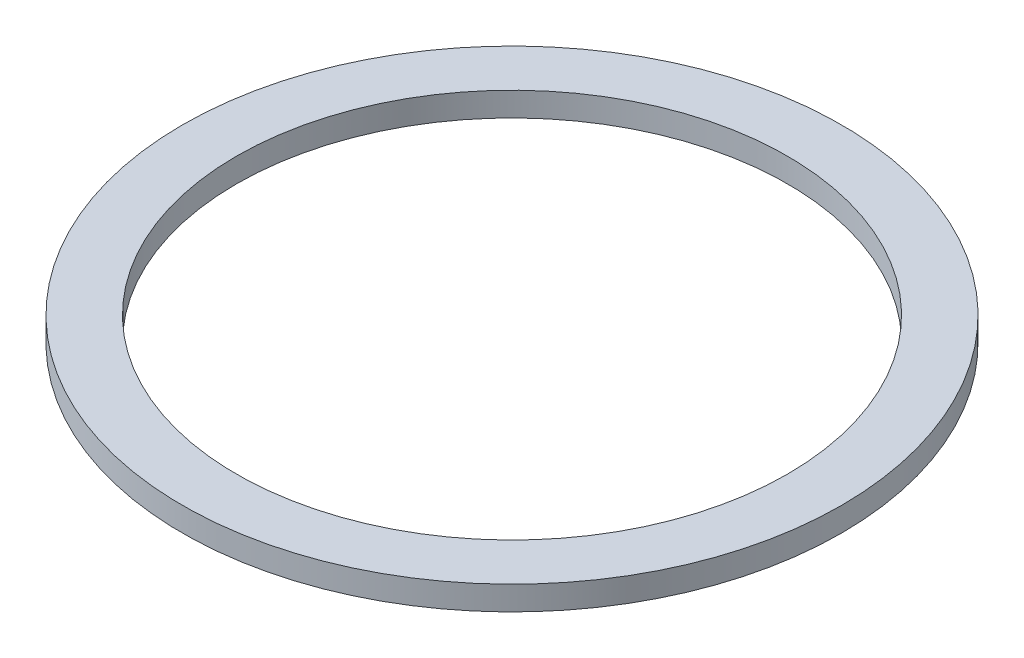
ISO-10303-21;
HEADER;
FILE_DESCRIPTION(('STEP AP214'),'2;1');
FILE_NAME('part.step','',(''),(''),'','','');
FILE_SCHEMA(('AUTOMOTIVE_DESIGN { 1 0 10303 214 1 1 1 1 }'));
ENDSEC;
DATA;
#1=APPLICATION_CONTEXT('core data for automotive mechanical design processes');
#2=APPLICATION_PROTOCOL_DEFINITION('international standard','automotive_design',2000,#1);
#3=PRODUCT_CONTEXT('',#1,'mechanical');
#4=PRODUCT('Part','Part','',(#3));
#5=PRODUCT_RELATED_PRODUCT_CATEGORY('part','',(#4));
#6=PRODUCT_DEFINITION_FORMATION('','',#4);
#7=PRODUCT_DEFINITION_CONTEXT('part definition',#1,'design');
#8=PRODUCT_DEFINITION('design','',#6,#7);
#9=PRODUCT_DEFINITION_SHAPE('','',#8);
#10=(LENGTH_UNIT() NAMED_UNIT(*) SI_UNIT(.MILLI.,.METRE.));
#11=(NAMED_UNIT(*) PLANE_ANGLE_UNIT() SI_UNIT($,.RADIAN.));
#12=(NAMED_UNIT(*) SI_UNIT($,.STERADIAN.) SOLID_ANGLE_UNIT());
#13=UNCERTAINTY_MEASURE_WITH_UNIT(LENGTH_MEASURE(1.E-05),#10,'distance_accuracy_value','');
#14=(GEOMETRIC_REPRESENTATION_CONTEXT(3) GLOBAL_UNCERTAINTY_ASSIGNED_CONTEXT((#13)) GLOBAL_UNIT_ASSIGNED_CONTEXT((#10,
#11,#12)) REPRESENTATION_CONTEXT('',''));
#15=CARTESIAN_POINT('',(0.,0.,0.));
#16=DIRECTION('',(0.,0.,1.));
#17=DIRECTION('',(1.,0.,0.));
#18=AXIS2_PLACEMENT_3D('',#15,#16,#17);
#19=CARTESIAN_POINT('',(145.526233776571,198.783659956239,0.));
#20=DIRECTION('',(0.,1.,0.));
#21=DIRECTION('',(-1.,0.,0.));
#22=AXIS2_PLACEMENT_3D('',#19,#20,#21);
#23=PLANE('',#22);
#24=CARTESIAN_POINT('',(-6.95186718038395E-13,198.783659956234,0.));
#25=DIRECTION('',(0.,-1.,0.));
#26=DIRECTION('',(1.,0.,0.));
#27=AXIS2_PLACEMENT_3D('',#24,#25,#26);
#28=CIRCLE('',#27,145.526233776572);
#29=CARTESIAN_POINT('',(145.526233776571,198.783659956235,0.));
#30=VERTEX_POINT('',#29);
#31=EDGE_CURVE('E47',#30,#30,#28,.T.);
#32=ORIENTED_EDGE('',*,*,#31,.T.);
#33=EDGE_LOOP('',(#32));
#34=FACE_BOUND('',#33,.T.);
#35=CARTESIAN_POINT('',(-6.95186718038395E-13,198.783659956234,0.));
#36=DIRECTION('',(0.,-1.,0.));
#37=DIRECTION('',(1.,0.,0.));
#38=AXIS2_PLACEMENT_3D('',#35,#36,#37);
#39=CIRCLE('',#38,174.101233776572);
#40=CARTESIAN_POINT('',(174.101233776571,198.783659956235,0.));
#41=VERTEX_POINT('',#40);
#42=EDGE_CURVE('E10',#41,#41,#39,.T.);
#43=ORIENTED_EDGE('',*,*,#42,.F.);
#44=EDGE_LOOP('',(#43));
#45=FACE_BOUND('',#44,.T.);
#46=ADVANCED_FACE('F33',(#34,#45),#23,.T.);
#47=CARTESIAN_POINT('',(6.99440505513849E-10,-200000.,0.));
#48=DIRECTION('',(0.,-1.,0.));
#49=DIRECTION('',(1.,0.,0.));
#50=AXIS2_PLACEMENT_3D('',#47,#48,#49);
#51=CYLINDRICAL_SURFACE('',#50,174.101233776572);
#52=ORIENTED_EDGE('',*,*,#42,.T.);
#53=EDGE_LOOP('',(#52));
#54=FACE_BOUND('',#53,.T.);
#55=CARTESIAN_POINT('',(-6.50772245938345E-13,186.083659956239,0.));
#56=DIRECTION('',(0.,-1.,0.));
#57=DIRECTION('',(1.,0.,0.));
#58=AXIS2_PLACEMENT_3D('',#55,#56,#57);
#59=CIRCLE('',#58,174.101233776572);
#60=CARTESIAN_POINT('',(174.101233776571,186.08365995624,0.));
#61=VERTEX_POINT('',#60);
#62=EDGE_CURVE('E39',#61,#61,#59,.T.);
#63=ORIENTED_EDGE('',*,*,#62,.F.);
#64=EDGE_LOOP('',(#63));
#65=FACE_BOUND('',#64,.T.);
#66=ADVANCED_FACE('F63',(#54,#65),#51,.T.);
#67=CARTESIAN_POINT('',(174.101233776571,186.083659956239,0.));
#68=DIRECTION('',(0.,-1.,0.));
#69=DIRECTION('',(1.,0.,0.));
#70=AXIS2_PLACEMENT_3D('',#67,#68,#69);
#71=PLANE('',#70);
#72=ORIENTED_EDGE('',*,*,#62,.T.);
#73=EDGE_LOOP('',(#72));
#74=FACE_BOUND('',#73,.T.);
#75=CARTESIAN_POINT('',(-6.50772245938345E-13,186.083659956239,0.));
#76=DIRECTION('',(0.,-1.,0.));
#77=DIRECTION('',(1.,0.,0.));
#78=AXIS2_PLACEMENT_3D('',#75,#76,#77);
#79=CIRCLE('',#78,145.526233776572);
#80=CARTESIAN_POINT('',(145.526233776571,186.08365995624,0.));
#81=VERTEX_POINT('',#80);
#82=EDGE_CURVE('E43',#81,#81,#79,.T.);
#83=ORIENTED_EDGE('',*,*,#82,.F.);
#84=EDGE_LOOP('',(#83));
#85=FACE_BOUND('',#84,.T.);
#86=ADVANCED_FACE('F57',(#74,#85),#71,.T.);
#87=CARTESIAN_POINT('',(6.99440505513849E-10,-200000.,0.));
#88=DIRECTION('',(0.,-1.,0.));
#89=DIRECTION('',(1.,0.,0.));
#90=AXIS2_PLACEMENT_3D('',#87,#88,#89);
#91=CYLINDRICAL_SURFACE('',#90,145.526233776572);
#92=ORIENTED_EDGE('',*,*,#82,.T.);
#93=EDGE_LOOP('',(#92));
#94=FACE_BOUND('',#93,.T.);
#95=ORIENTED_EDGE('',*,*,#31,.F.);
#96=EDGE_LOOP('',(#95));
#97=FACE_BOUND('',#96,.T.);
#98=ADVANCED_FACE('F55',(#94,#97),#91,.F.);
#99=CLOSED_SHELL('',(#46,#66,#86,#98));
#100=MANIFOLD_SOLID_BREP('B2',#99);
#101=ADVANCED_BREP_SHAPE_REPRESENTATION('',(#18,#100),#14);
#102=SHAPE_DEFINITION_REPRESENTATION(#9,#101);
ENDSEC;
END-ISO-10303-21;
